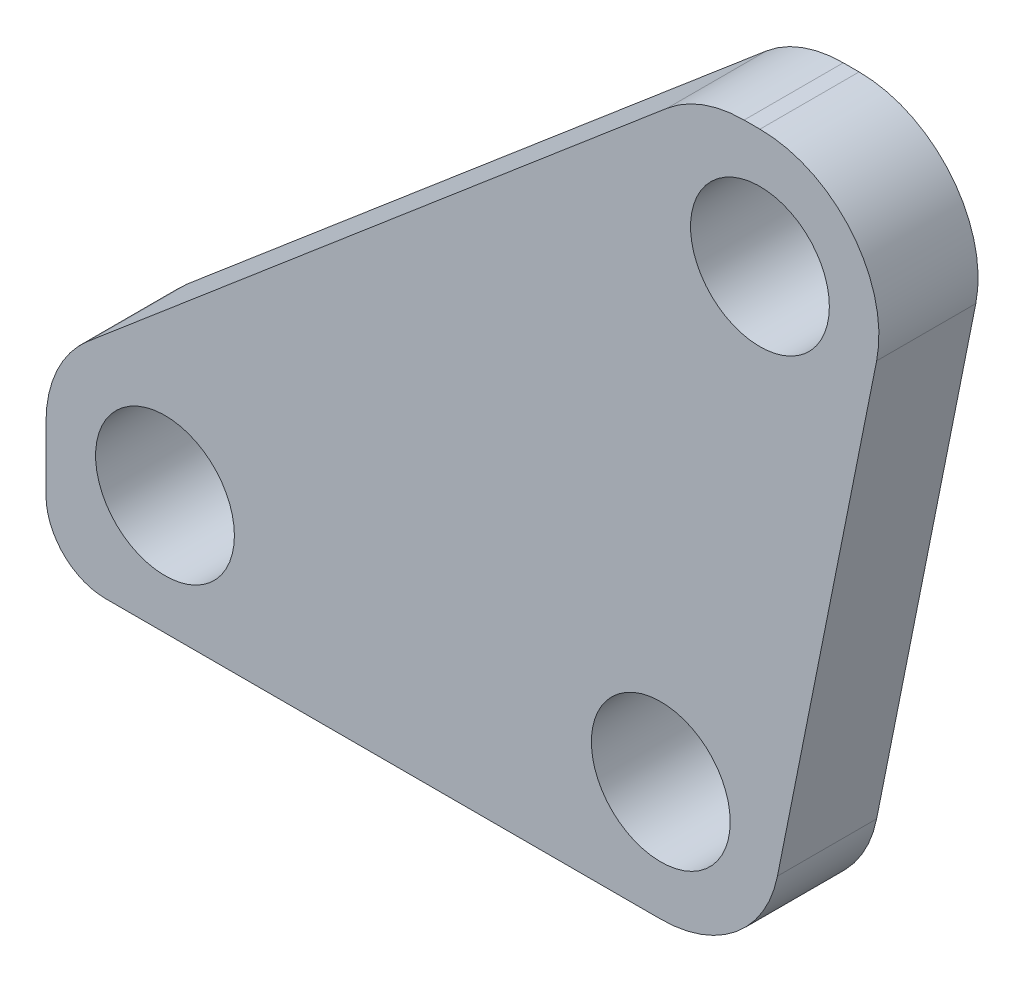
ISO-10303-21;
HEADER;
FILE_DESCRIPTION(('STEP AP214'),'2;1');
FILE_NAME('part.step','',(''),(''),'','','');
FILE_SCHEMA(('AUTOMOTIVE_DESIGN { 1 0 10303 214 1 1 1 1 }'));
ENDSEC;
DATA;
#1=APPLICATION_CONTEXT('core data for automotive mechanical design processes');
#2=APPLICATION_PROTOCOL_DEFINITION('international standard','automotive_design',2000,#1);
#3=PRODUCT_CONTEXT('',#1,'mechanical');
#4=PRODUCT('Part','Part','',(#3));
#5=PRODUCT_RELATED_PRODUCT_CATEGORY('part','',(#4));
#6=PRODUCT_DEFINITION_FORMATION('','',#4);
#7=PRODUCT_DEFINITION_CONTEXT('part definition',#1,'design');
#8=PRODUCT_DEFINITION('design','',#6,#7);
#9=PRODUCT_DEFINITION_SHAPE('','',#8);
#10=(LENGTH_UNIT() NAMED_UNIT(*) SI_UNIT(.MILLI.,.METRE.));
#11=(NAMED_UNIT(*) PLANE_ANGLE_UNIT() SI_UNIT($,.RADIAN.));
#12=(NAMED_UNIT(*) SI_UNIT($,.STERADIAN.) SOLID_ANGLE_UNIT());
#13=UNCERTAINTY_MEASURE_WITH_UNIT(LENGTH_MEASURE(1.E-05),#10,'distance_accuracy_value','');
#14=(GEOMETRIC_REPRESENTATION_CONTEXT(3) GLOBAL_UNCERTAINTY_ASSIGNED_CONTEXT((#13)) GLOBAL_UNIT_ASSIGNED_CONTEXT((#10,
#11,#12)) REPRESENTATION_CONTEXT('',''));
#15=CARTESIAN_POINT('',(0.,0.,0.));
#16=DIRECTION('',(0.,0.,1.));
#17=DIRECTION('',(1.,0.,0.));
#18=AXIS2_PLACEMENT_3D('',#15,#16,#17);
#19=CARTESIAN_POINT('',(12.5,0.,-5.));
#20=DIRECTION('',(0.,0.,1.));
#21=DIRECTION('',(1.,0.,0.));
#22=AXIS2_PLACEMENT_3D('',#19,#20,#21);
#23=CYLINDRICAL_SURFACE('',#22,6.);
#24=CARTESIAN_POINT('',(12.5,0.,0.));
#25=DIRECTION('',(0.,0.,1.));
#26=DIRECTION('',(1.,0.,0.));
#27=AXIS2_PLACEMENT_3D('',#24,#25,#26);
#28=CIRCLE('',#27,6.);
#29=CARTESIAN_POINT('',(12.5,-6.,0.));
#30=VERTEX_POINT('',#29);
#31=CARTESIAN_POINT('',(18.3834840541455,-1.1766968108291,0.));
#32=VERTEX_POINT('',#31);
#33=EDGE_CURVE('E149',#30,#32,#28,.T.);
#34=ORIENTED_EDGE('',*,*,#33,.F.);
#35=DIRECTION('',(0.,0.,1.));
#36=VECTOR('',#35,1.);
#37=CARTESIAN_POINT('',(12.5,-6.,-5.));
#38=LINE('',#37,#36);
#39=CARTESIAN_POINT('',(12.5,-6.,-5.));
#40=VERTEX_POINT('',#39);
#41=EDGE_CURVE('E12',#40,#30,#38,.T.);
#42=ORIENTED_EDGE('',*,*,#41,.F.);
#43=CARTESIAN_POINT('',(12.5,0.,-5.));
#44=DIRECTION('',(0.,0.,1.));
#45=DIRECTION('',(1.,0.,0.));
#46=AXIS2_PLACEMENT_3D('',#43,#44,#45);
#47=CIRCLE('',#46,6.);
#48=CARTESIAN_POINT('',(18.3834840541455,-1.1766968108291,-5.));
#49=VERTEX_POINT('',#48);
#50=EDGE_CURVE('E202',#40,#49,#47,.T.);
#51=ORIENTED_EDGE('',*,*,#50,.T.);
#52=DIRECTION('',(0.,0.,1.));
#53=VECTOR('',#52,1.);
#54=CARTESIAN_POINT('',(18.3834840541455,-1.1766968108291,-5.));
#55=LINE('',#54,#53);
#56=EDGE_CURVE('E43',#49,#32,#55,.T.);
#57=ORIENTED_EDGE('',*,*,#56,.T.);
#58=EDGE_LOOP('',(#34,#42,#51,#57));
#59=FACE_BOUND('',#58,.T.);
#60=ADVANCED_FACE('F40',(#59),#23,.T.);
#61=CARTESIAN_POINT('',(-15.5,-6.,-5.));
#62=DIRECTION('',(0.,-1.,0.));
#63=DIRECTION('',(1.,0.,0.));
#64=AXIS2_PLACEMENT_3D('',#61,#62,#63);
#65=PLANE('',#64);
#66=DIRECTION('',(1.,0.,0.));
#67=VECTOR('',#66,1.);
#68=CARTESIAN_POINT('',(-15.5,-6.,0.));
#69=LINE('',#68,#67);
#70=CARTESIAN_POINT('',(-15.5,-6.,0.));
#71=VERTEX_POINT('',#70);
#72=EDGE_CURVE('E198',#71,#30,#69,.T.);
#73=ORIENTED_EDGE('',*,*,#72,.F.);
#74=DIRECTION('',(0.,0.,1.));
#75=VECTOR('',#74,1.);
#76=CARTESIAN_POINT('',(-15.5,-6.,-5.));
#77=LINE('',#76,#75);
#78=CARTESIAN_POINT('',(-15.5,-6.,-5.));
#79=VERTEX_POINT('',#78);
#80=EDGE_CURVE('E49',#79,#71,#77,.T.);
#81=ORIENTED_EDGE('',*,*,#80,.F.);
#82=DIRECTION('',(1.,0.,0.));
#83=VECTOR('',#82,1.);
#84=CARTESIAN_POINT('',(-15.5,-6.,-5.));
#85=LINE('',#84,#83);
#86=EDGE_CURVE('E139',#79,#40,#85,.T.);
#87=ORIENTED_EDGE('',*,*,#86,.T.);
#88=ORIENTED_EDGE('',*,*,#41,.T.);
#89=EDGE_LOOP('',(#73,#81,#87,#88));
#90=FACE_BOUND('',#89,.T.);
#91=ADVANCED_FACE('F220',(#90),#65,.T.);
#92=CARTESIAN_POINT('',(-15.5,-3.,-5.));
#93=DIRECTION('',(0.,0.,1.));
#94=DIRECTION('',(1.,0.,0.));
#95=AXIS2_PLACEMENT_3D('',#92,#93,#94);
#96=CYLINDRICAL_SURFACE('',#95,3.);
#97=CARTESIAN_POINT('',(-15.5,-3.,0.));
#98=DIRECTION('',(0.,0.,1.));
#99=DIRECTION('',(-1.,0.,0.));
#100=AXIS2_PLACEMENT_3D('',#97,#98,#99);
#101=CIRCLE('',#100,3.);
#102=CARTESIAN_POINT('',(-18.5,-3.,0.));
#103=VERTEX_POINT('',#102);
#104=EDGE_CURVE('E126',#103,#71,#101,.T.);
#105=ORIENTED_EDGE('',*,*,#104,.F.);
#106=DIRECTION('',(0.,0.,1.));
#107=VECTOR('',#106,1.);
#108=CARTESIAN_POINT('',(-18.5,-3.,-5.));
#109=LINE('',#108,#107);
#110=CARTESIAN_POINT('',(-18.5,-3.,-5.));
#111=VERTEX_POINT('',#110);
#112=EDGE_CURVE('E121',#111,#103,#109,.T.);
#113=ORIENTED_EDGE('',*,*,#112,.F.);
#114=CARTESIAN_POINT('',(-15.5,-3.,-5.));
#115=DIRECTION('',(0.,0.,1.));
#116=DIRECTION('',(-1.,0.,0.));
#117=AXIS2_PLACEMENT_3D('',#114,#115,#116);
#118=CIRCLE('',#117,3.);
#119=EDGE_CURVE('E124',#111,#79,#118,.T.);
#120=ORIENTED_EDGE('',*,*,#119,.T.);
#121=ORIENTED_EDGE('',*,*,#80,.T.);
#122=EDGE_LOOP('',(#105,#113,#120,#121));
#123=FACE_BOUND('',#122,.T.);
#124=ADVANCED_FACE('F123',(#123),#96,.T.);
#125=CARTESIAN_POINT('',(-18.5,-2.99999999999998,-5.));
#126=DIRECTION('',(-1.,0.,0.));
#127=DIRECTION('',(0.,0.,1.));
#128=AXIS2_PLACEMENT_3D('',#125,#126,#127);
#129=PLANE('',#128);
#130=DIRECTION('',(0.,-1.,0.));
#131=VECTOR('',#130,1.);
#132=CARTESIAN_POINT('',(-18.5,-2.99999999999998,0.));
#133=LINE('',#132,#131);
#134=CARTESIAN_POINT('',(-18.5,0.222150906042763,0.));
#135=VERTEX_POINT('',#134);
#136=EDGE_CURVE('E192',#135,#103,#133,.T.);
#137=ORIENTED_EDGE('',*,*,#136,.F.);
#138=DIRECTION('',(0.,0.,1.));
#139=VECTOR('',#138,1.);
#140=CARTESIAN_POINT('',(-18.5,0.222150906042763,-5.));
#141=LINE('',#140,#139);
#142=CARTESIAN_POINT('',(-18.5,0.222150906042763,-5.));
#143=VERTEX_POINT('',#142);
#144=EDGE_CURVE('E131',#143,#135,#141,.T.);
#145=ORIENTED_EDGE('',*,*,#144,.F.);
#146=DIRECTION('',(0.,-1.,0.));
#147=VECTOR('',#146,1.);
#148=CARTESIAN_POINT('',(-18.5,-2.99999999999998,-5.));
#149=LINE('',#148,#147);
#150=EDGE_CURVE('E137',#143,#111,#149,.T.);
#151=ORIENTED_EDGE('',*,*,#150,.T.);
#152=ORIENTED_EDGE('',*,*,#112,.T.);
#153=EDGE_LOOP('',(#137,#145,#151,#152));
#154=FACE_BOUND('',#153,.T.);
#155=ADVANCED_FACE('F141',(#154),#129,.T.);
#156=CARTESIAN_POINT('',(-12.5,0.222150906042763,-5.));
#157=DIRECTION('',(0.,0.,1.));
#158=DIRECTION('',(1.,0.,0.));
#159=AXIS2_PLACEMENT_3D('',#156,#157,#158);
#160=CYLINDRICAL_SURFACE('',#159,6.);
#161=CARTESIAN_POINT('',(-12.5,0.222150906042763,0.));
#162=DIRECTION('',(0.,0.,1.));
#163=DIRECTION('',(-1.,0.,0.));
#164=AXIS2_PLACEMENT_3D('',#161,#162,#163);
#165=CIRCLE('',#164,6.);
#166=CARTESIAN_POINT('',(-16.3818646891706,4.79720571827951,0.));
#167=VERTEX_POINT('',#166);
#168=EDGE_CURVE('E188',#167,#135,#165,.T.);
#169=ORIENTED_EDGE('',*,*,#168,.F.);
#170=DIRECTION('',(0.,0.,1.));
#171=VECTOR('',#170,1.);
#172=CARTESIAN_POINT('',(-16.3818646891706,4.79720571827951,-5.));
#173=LINE('',#172,#171);
#174=CARTESIAN_POINT('',(-16.3818646891706,4.79720571827951,-5.));
#175=VERTEX_POINT('',#174);
#176=EDGE_CURVE('E206',#175,#167,#173,.T.);
#177=ORIENTED_EDGE('',*,*,#176,.F.);
#178=CARTESIAN_POINT('',(-12.5,0.222150906042763,-5.));
#179=DIRECTION('',(0.,0.,1.));
#180=DIRECTION('',(-1.,0.,0.));
#181=AXIS2_PLACEMENT_3D('',#178,#179,#180);
#182=CIRCLE('',#181,6.);
#183=EDGE_CURVE('E142',#175,#143,#182,.T.);
#184=ORIENTED_EDGE('',*,*,#183,.T.);
#185=ORIENTED_EDGE('',*,*,#144,.T.);
#186=EDGE_LOOP('',(#169,#177,#184,#185));
#187=FACE_BOUND('',#186,.T.);
#188=ADVANCED_FACE('F233',(#187),#160,.T.);
#189=CARTESIAN_POINT('',(-16.3818646891706,4.79720571827951,-5.));
#190=DIRECTION('',(-0.646977448195096,0.762509135372792,0.));
#191=DIRECTION('',(-0.762509135372792,-0.646977448195096,0.));
#192=AXIS2_PLACEMENT_3D('',#189,#190,#191);
#193=PLANE('',#192);
#194=DIRECTION('',(-0.762509135372792,-0.646977448195096,0.));
#195=VECTOR('',#194,1.);
#196=CARTESIAN_POINT('',(-16.3818646891706,4.79720571827951,0.));
#197=LINE('',#196,#195);
#198=CARTESIAN_POINT('',(12.8206003144219,29.5750548122367,0.));
#199=VERTEX_POINT('',#198);
#200=EDGE_CURVE('E181',#199,#167,#197,.T.);
#201=ORIENTED_EDGE('',*,*,#200,.F.);
#202=DIRECTION('',(0.,0.,1.));
#203=VECTOR('',#202,1.);
#204=CARTESIAN_POINT('',(12.8206003144219,29.5750548122367,-5.));
#205=LINE('',#204,#203);
#206=CARTESIAN_POINT('',(12.8206003144219,29.5750548122367,-5.));
#207=VERTEX_POINT('',#206);
#208=EDGE_CURVE('E208',#207,#199,#205,.T.);
#209=ORIENTED_EDGE('',*,*,#208,.F.);
#210=DIRECTION('',(-0.762509135372792,-0.646977448195096,0.));
#211=VECTOR('',#210,1.);
#212=CARTESIAN_POINT('',(-16.3818646891706,4.79720571827951,-5.));
#213=LINE('',#212,#211);
#214=EDGE_CURVE('E144',#207,#175,#213,.T.);
#215=ORIENTED_EDGE('',*,*,#214,.T.);
#216=ORIENTED_EDGE('',*,*,#176,.T.);
#217=EDGE_LOOP('',(#201,#209,#215,#216));
#218=FACE_BOUND('',#217,.T.);
#219=ADVANCED_FACE('F236',(#218),#193,.T.);
#220=CARTESIAN_POINT('',(16.7024650035925,25.,-5.));
#221=DIRECTION('',(0.,0.,1.));
#222=DIRECTION('',(1.,0.,0.));
#223=AXIS2_PLACEMENT_3D('',#220,#221,#222);
#224=CYLINDRICAL_SURFACE('',#223,6.);
#225=CARTESIAN_POINT('',(16.7024650035925,25.,0.));
#226=DIRECTION('',(0.,0.,1.));
#227=DIRECTION('',(-1.,0.,0.));
#228=AXIS2_PLACEMENT_3D('',#225,#226,#227);
#229=CIRCLE('',#228,6.);
#230=CARTESIAN_POINT('',(16.7024650035925,31.,0.));
#231=VERTEX_POINT('',#230);
#232=EDGE_CURVE('E176',#231,#199,#229,.T.);
#233=ORIENTED_EDGE('',*,*,#232,.F.);
#234=DIRECTION('',(0.,0.,1.));
#235=VECTOR('',#234,1.);
#236=CARTESIAN_POINT('',(16.7024650035925,31.,-5.));
#237=LINE('',#236,#235);
#238=CARTESIAN_POINT('',(16.7024650035925,31.,-5.));
#239=VERTEX_POINT('',#238);
#240=EDGE_CURVE('E210',#239,#231,#237,.T.);
#241=ORIENTED_EDGE('',*,*,#240,.F.);
#242=CARTESIAN_POINT('',(16.7024650035925,25.,-5.));
#243=DIRECTION('',(0.,0.,1.));
#244=DIRECTION('',(-1.,0.,0.));
#245=AXIS2_PLACEMENT_3D('',#242,#243,#244);
#246=CIRCLE('',#245,6.);
#247=EDGE_CURVE('E311',#239,#207,#246,.T.);
#248=ORIENTED_EDGE('',*,*,#247,.T.);
#249=ORIENTED_EDGE('',*,*,#208,.T.);
#250=EDGE_LOOP('',(#233,#241,#248,#249));
#251=FACE_BOUND('',#250,.T.);
#252=ADVANCED_FACE('F240',(#251),#224,.T.);
#253=CARTESIAN_POINT('',(16.7024650035925,31.,-5.));
#254=DIRECTION('',(0.,1.,0.));
#255=DIRECTION('',(0.,0.,1.));
#256=AXIS2_PLACEMENT_3D('',#253,#254,#255);
#257=PLANE('',#256);
#258=DIRECTION('',(-1.,0.,0.));
#259=VECTOR('',#258,1.);
#260=CARTESIAN_POINT('',(16.7024650035925,31.,0.));
#261=LINE('',#260,#259);
#262=CARTESIAN_POINT('',(17.5,31.,0.));
#263=VERTEX_POINT('',#262);
#264=EDGE_CURVE('E171',#263,#231,#261,.T.);
#265=ORIENTED_EDGE('',*,*,#264,.F.);
#266=DIRECTION('',(0.,0.,1.));
#267=VECTOR('',#266,1.);
#268=CARTESIAN_POINT('',(17.5,31.,-5.));
#269=LINE('',#268,#267);
#270=CARTESIAN_POINT('',(17.5,31.,-5.));
#271=VERTEX_POINT('',#270);
#272=EDGE_CURVE('E212',#271,#263,#269,.T.);
#273=ORIENTED_EDGE('',*,*,#272,.F.);
#274=DIRECTION('',(-1.,0.,0.));
#275=VECTOR('',#274,1.);
#276=CARTESIAN_POINT('',(16.7024650035925,31.,-5.));
#277=LINE('',#276,#275);
#278=EDGE_CURVE('E308',#271,#239,#277,.T.);
#279=ORIENTED_EDGE('',*,*,#278,.T.);
#280=ORIENTED_EDGE('',*,*,#240,.T.);
#281=EDGE_LOOP('',(#265,#273,#279,#280));
#282=FACE_BOUND('',#281,.T.);
#283=ADVANCED_FACE('F244',(#282),#257,.T.);
#284=CARTESIAN_POINT('',(17.5,25.,-5.));
#285=DIRECTION('',(0.,0.,1.));
#286=DIRECTION('',(1.,0.,0.));
#287=AXIS2_PLACEMENT_3D('',#284,#285,#286);
#288=CYLINDRICAL_SURFACE('',#287,6.);
#289=CARTESIAN_POINT('',(17.5,25.,0.));
#290=DIRECTION('',(0.,0.,1.));
#291=DIRECTION('',(-1.,0.,0.));
#292=AXIS2_PLACEMENT_3D('',#289,#290,#291);
#293=CIRCLE('',#292,6.);
#294=CARTESIAN_POINT('',(23.3834840541455,23.8233031891709,0.));
#295=VERTEX_POINT('',#294);
#296=EDGE_CURVE('E167',#295,#263,#293,.T.);
#297=ORIENTED_EDGE('',*,*,#296,.F.);
#298=DIRECTION('',(0.,0.,1.));
#299=VECTOR('',#298,1.);
#300=CARTESIAN_POINT('',(23.3834840541455,23.8233031891709,-5.));
#301=LINE('',#300,#299);
#302=CARTESIAN_POINT('',(23.3834840541455,23.8233031891709,-5.));
#303=VERTEX_POINT('',#302);
#304=EDGE_CURVE('E213',#303,#295,#301,.T.);
#305=ORIENTED_EDGE('',*,*,#304,.F.);
#306=CARTESIAN_POINT('',(17.5,25.,-5.));
#307=DIRECTION('',(0.,0.,1.));
#308=DIRECTION('',(-1.,0.,0.));
#309=AXIS2_PLACEMENT_3D('',#306,#307,#308);
#310=CIRCLE('',#309,6.);
#311=EDGE_CURVE('E305',#303,#271,#310,.T.);
#312=ORIENTED_EDGE('',*,*,#311,.T.);
#313=ORIENTED_EDGE('',*,*,#272,.T.);
#314=EDGE_LOOP('',(#297,#305,#312,#313));
#315=FACE_BOUND('',#314,.T.);
#316=ADVANCED_FACE('F248',(#315),#288,.T.);
#317=CARTESIAN_POINT('',(18.3834840541455,-1.1766968108291,-5.));
#318=DIRECTION('',(0.98058067569092,-0.196116135138184,0.));
#319=DIRECTION('',(0.196116135138184,0.98058067569092,0.));
#320=AXIS2_PLACEMENT_3D('',#317,#318,#319);
#321=PLANE('',#320);
#322=DIRECTION('',(0.196116135138184,0.98058067569092,0.));
#323=VECTOR('',#322,1.);
#324=CARTESIAN_POINT('',(18.3834840541455,-1.1766968108291,0.));
#325=LINE('',#324,#323);
#326=EDGE_CURVE('E154',#32,#295,#325,.T.);
#327=ORIENTED_EDGE('',*,*,#326,.F.);
#328=ORIENTED_EDGE('',*,*,#56,.F.);
#329=DIRECTION('',(0.196116135138184,0.98058067569092,0.));
#330=VECTOR('',#329,1.);
#331=CARTESIAN_POINT('',(18.3834840541455,-1.1766968108291,-5.));
#332=LINE('',#331,#330);
#333=EDGE_CURVE('E303',#49,#303,#332,.T.);
#334=ORIENTED_EDGE('',*,*,#333,.T.);
#335=ORIENTED_EDGE('',*,*,#304,.T.);
#336=EDGE_LOOP('',(#327,#328,#334,#335));
#337=FACE_BOUND('',#336,.T.);
#338=ADVANCED_FACE('F216',(#337),#321,.T.);
#339=CARTESIAN_POINT('',(12.5,0.,-5.));
#340=DIRECTION('',(0.,0.,1.));
#341=DIRECTION('',(1.,0.,0.));
#342=AXIS2_PLACEMENT_3D('',#339,#340,#341);
#343=PLANE('',#342);
#344=CARTESIAN_POINT('',(-12.5,0.,-5.));
#345=DIRECTION('',(0.,0.,1.));
#346=DIRECTION('',(1.,0.,0.));
#347=AXIS2_PLACEMENT_3D('',#344,#345,#346);
#348=CIRCLE('',#347,3.5);
#349=CARTESIAN_POINT('',(-9.,0.,-5.));
#350=VERTEX_POINT('',#349);
#351=EDGE_CURVE('E279',#350,#350,#348,.T.);
#352=ORIENTED_EDGE('',*,*,#351,.T.);
#353=EDGE_LOOP('',(#352));
#354=FACE_BOUND('',#353,.T.);
#355=CARTESIAN_POINT('',(12.5,0.,-5.));
#356=DIRECTION('',(0.,0.,1.));
#357=DIRECTION('',(1.,0.,0.));
#358=AXIS2_PLACEMENT_3D('',#355,#356,#357);
#359=CIRCLE('',#358,3.5);
#360=CARTESIAN_POINT('',(16.,0.,-5.));
#361=VERTEX_POINT('',#360);
#362=EDGE_CURVE('E290',#361,#361,#359,.T.);
#363=ORIENTED_EDGE('',*,*,#362,.T.);
#364=EDGE_LOOP('',(#363));
#365=FACE_BOUND('',#364,.T.);
#366=CARTESIAN_POINT('',(17.5,25.,-5.));
#367=DIRECTION('',(0.,0.,1.));
#368=DIRECTION('',(1.,0.,0.));
#369=AXIS2_PLACEMENT_3D('',#366,#367,#368);
#370=CIRCLE('',#369,3.5);
#371=CARTESIAN_POINT('',(21.,25.,-5.));
#372=VERTEX_POINT('',#371);
#373=EDGE_CURVE('E155',#372,#372,#370,.T.);
#374=ORIENTED_EDGE('',*,*,#373,.T.);
#375=EDGE_LOOP('',(#374));
#376=FACE_BOUND('',#375,.T.);
#377=ORIENTED_EDGE('',*,*,#50,.F.);
#378=ORIENTED_EDGE('',*,*,#86,.F.);
#379=ORIENTED_EDGE('',*,*,#119,.F.);
#380=ORIENTED_EDGE('',*,*,#150,.F.);
#381=ORIENTED_EDGE('',*,*,#183,.F.);
#382=ORIENTED_EDGE('',*,*,#214,.F.);
#383=ORIENTED_EDGE('',*,*,#247,.F.);
#384=ORIENTED_EDGE('',*,*,#278,.F.);
#385=ORIENTED_EDGE('',*,*,#311,.F.);
#386=ORIENTED_EDGE('',*,*,#333,.F.);
#387=EDGE_LOOP('',(#377,#378,#379,#380,#381,#382,#383,#384,#385,#386));
#388=FACE_BOUND('',#387,.T.);
#389=ADVANCED_FACE('F135',(#354,#365,#376,#388),#343,.F.);
#390=CARTESIAN_POINT('',(12.5,0.,0.));
#391=DIRECTION('',(0.,0.,1.));
#392=DIRECTION('',(1.,0.,0.));
#393=AXIS2_PLACEMENT_3D('',#390,#391,#392);
#394=PLANE('',#393);
#395=CARTESIAN_POINT('',(-12.5,0.,0.));
#396=DIRECTION('',(0.,0.,1.));
#397=DIRECTION('',(1.,0.,0.));
#398=AXIS2_PLACEMENT_3D('',#395,#396,#397);
#399=CIRCLE('',#398,3.5);
#400=CARTESIAN_POINT('',(-9.,0.,0.));
#401=VERTEX_POINT('',#400);
#402=EDGE_CURVE('E282',#401,#401,#399,.T.);
#403=ORIENTED_EDGE('',*,*,#402,.F.);
#404=EDGE_LOOP('',(#403));
#405=FACE_BOUND('',#404,.T.);
#406=CARTESIAN_POINT('',(12.5,0.,0.));
#407=DIRECTION('',(0.,0.,1.));
#408=DIRECTION('',(1.,0.,0.));
#409=AXIS2_PLACEMENT_3D('',#406,#407,#408);
#410=CIRCLE('',#409,3.5);
#411=CARTESIAN_POINT('',(16.,0.,0.));
#412=VERTEX_POINT('',#411);
#413=EDGE_CURVE('E286',#412,#412,#410,.T.);
#414=ORIENTED_EDGE('',*,*,#413,.F.);
#415=EDGE_LOOP('',(#414));
#416=FACE_BOUND('',#415,.T.);
#417=CARTESIAN_POINT('',(17.5,25.,0.));
#418=DIRECTION('',(0.,0.,1.));
#419=DIRECTION('',(1.,0.,0.));
#420=AXIS2_PLACEMENT_3D('',#417,#418,#419);
#421=CIRCLE('',#420,3.5);
#422=CARTESIAN_POINT('',(21.,25.,0.));
#423=VERTEX_POINT('',#422);
#424=EDGE_CURVE('E297',#423,#423,#421,.T.);
#425=ORIENTED_EDGE('',*,*,#424,.F.);
#426=EDGE_LOOP('',(#425));
#427=FACE_BOUND('',#426,.T.);
#428=ORIENTED_EDGE('',*,*,#33,.T.);
#429=ORIENTED_EDGE('',*,*,#326,.T.);
#430=ORIENTED_EDGE('',*,*,#296,.T.);
#431=ORIENTED_EDGE('',*,*,#264,.T.);
#432=ORIENTED_EDGE('',*,*,#232,.T.);
#433=ORIENTED_EDGE('',*,*,#200,.T.);
#434=ORIENTED_EDGE('',*,*,#168,.T.);
#435=ORIENTED_EDGE('',*,*,#136,.T.);
#436=ORIENTED_EDGE('',*,*,#104,.T.);
#437=ORIENTED_EDGE('',*,*,#72,.T.);
#438=EDGE_LOOP('',(#428,#429,#430,#431,#432,#433,#434,#435,#436,#437));
#439=FACE_BOUND('',#438,.T.);
#440=ADVANCED_FACE('F219',(#405,#416,#427,#439),#394,.T.);
#441=CARTESIAN_POINT('',(17.5,25.,-5.));
#442=DIRECTION('',(0.,0.,1.));
#443=DIRECTION('',(1.,0.,0.));
#444=AXIS2_PLACEMENT_3D('',#441,#442,#443);
#445=CYLINDRICAL_SURFACE('',#444,3.5);
#446=ORIENTED_EDGE('',*,*,#373,.F.);
#447=EDGE_LOOP('',(#446));
#448=FACE_BOUND('',#447,.T.);
#449=ORIENTED_EDGE('',*,*,#424,.T.);
#450=EDGE_LOOP('',(#449));
#451=FACE_BOUND('',#450,.T.);
#452=ADVANCED_FACE('F260',(#448,#451),#445,.F.);
#453=CARTESIAN_POINT('',(12.5,0.,-5.));
#454=DIRECTION('',(0.,0.,1.));
#455=DIRECTION('',(1.,0.,0.));
#456=AXIS2_PLACEMENT_3D('',#453,#454,#455);
#457=CYLINDRICAL_SURFACE('',#456,3.5);
#458=ORIENTED_EDGE('',*,*,#362,.F.);
#459=EDGE_LOOP('',(#458));
#460=FACE_BOUND('',#459,.T.);
#461=ORIENTED_EDGE('',*,*,#413,.T.);
#462=EDGE_LOOP('',(#461));
#463=FACE_BOUND('',#462,.T.);
#464=ADVANCED_FACE('F267',(#460,#463),#457,.F.);
#465=CARTESIAN_POINT('',(-12.5,0.,-5.));
#466=DIRECTION('',(0.,0.,1.));
#467=DIRECTION('',(1.,0.,0.));
#468=AXIS2_PLACEMENT_3D('',#465,#466,#467);
#469=CYLINDRICAL_SURFACE('',#468,3.5);
#470=ORIENTED_EDGE('',*,*,#351,.F.);
#471=EDGE_LOOP('',(#470));
#472=FACE_BOUND('',#471,.T.);
#473=ORIENTED_EDGE('',*,*,#402,.T.);
#474=EDGE_LOOP('',(#473));
#475=FACE_BOUND('',#474,.T.);
#476=ADVANCED_FACE('F271',(#472,#475),#469,.F.);
#477=CLOSED_SHELL('',(#60,#91,#124,#155,#188,#219,#252,#283,#316,#338,#389,#440,#452,#464,#476));
#478=MANIFOLD_SOLID_BREP('B2',#477);
#479=ADVANCED_BREP_SHAPE_REPRESENTATION('',(#18,#478),#14);
#480=SHAPE_DEFINITION_REPRESENTATION(#9,#479);
ENDSEC;
END-ISO-10303-21;
